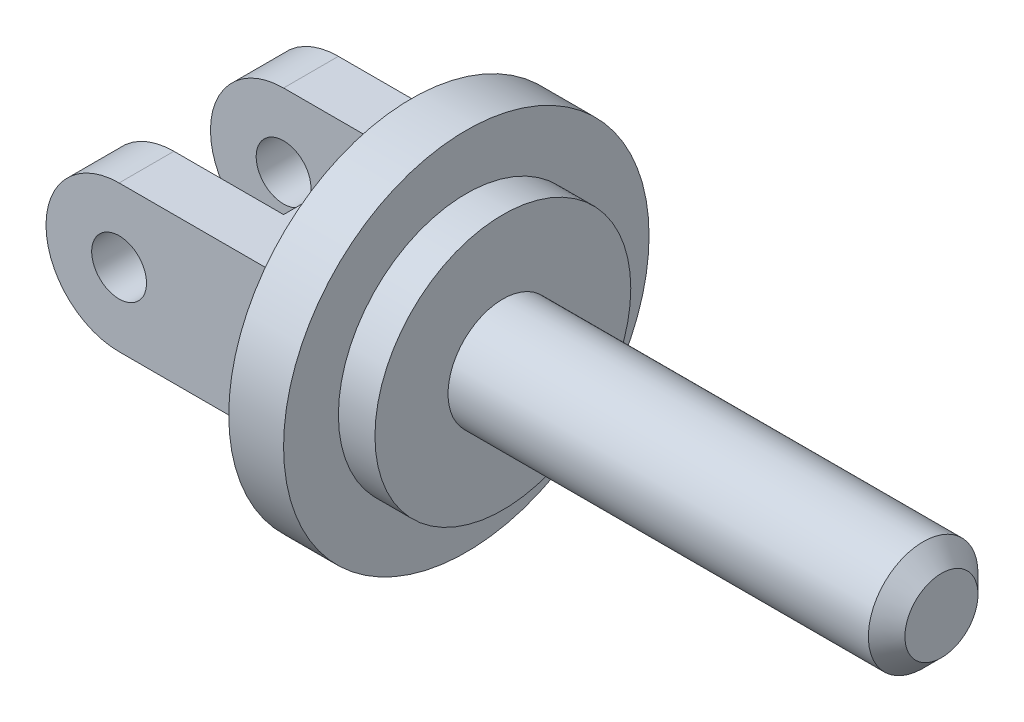
ISO-10303-21;
HEADER;
FILE_DESCRIPTION(('STEP AP214'),'2;1');
FILE_NAME('part.step','',(''),(''),'','','');
FILE_SCHEMA(('AUTOMOTIVE_DESIGN { 1 0 10303 214 1 1 1 1 }'));
ENDSEC;
DATA;
#1=APPLICATION_CONTEXT('core data for automotive mechanical design processes');
#2=APPLICATION_PROTOCOL_DEFINITION('international standard','automotive_design',2000,#1);
#3=PRODUCT_CONTEXT('',#1,'mechanical');
#4=PRODUCT('Part','Part','',(#3));
#5=PRODUCT_RELATED_PRODUCT_CATEGORY('part','',(#4));
#6=PRODUCT_DEFINITION_FORMATION('','',#4);
#7=PRODUCT_DEFINITION_CONTEXT('part definition',#1,'design');
#8=PRODUCT_DEFINITION('design','',#6,#7);
#9=PRODUCT_DEFINITION_SHAPE('','',#8);
#10=(LENGTH_UNIT() NAMED_UNIT(*) SI_UNIT(.MILLI.,.METRE.));
#11=(NAMED_UNIT(*) PLANE_ANGLE_UNIT() SI_UNIT($,.RADIAN.));
#12=(NAMED_UNIT(*) SI_UNIT($,.STERADIAN.) SOLID_ANGLE_UNIT());
#13=UNCERTAINTY_MEASURE_WITH_UNIT(LENGTH_MEASURE(1.E-05),#10,'distance_accuracy_value','');
#14=(GEOMETRIC_REPRESENTATION_CONTEXT(3) GLOBAL_UNCERTAINTY_ASSIGNED_CONTEXT((#13)) GLOBAL_UNIT_ASSIGNED_CONTEXT((#10,
#11,#12)) REPRESENTATION_CONTEXT('',''));
#15=CARTESIAN_POINT('',(0.,0.,0.));
#16=DIRECTION('',(0.,0.,1.));
#17=DIRECTION('',(1.,0.,0.));
#18=AXIS2_PLACEMENT_3D('',#15,#16,#17);
#19=CARTESIAN_POINT('',(0.,0.,3.));
#20=DIRECTION('',(0.,0.,-1.));
#21=DIRECTION('',(-1.,0.,0.));
#22=AXIS2_PLACEMENT_3D('',#19,#20,#21);
#23=CYLINDRICAL_SURFACE('',#22,2.);
#24=DIRECTION('',(0.,0.,-1.));
#25=VECTOR('',#24,1.);
#26=CARTESIAN_POINT('',(0.,2.,3.));
#27=LINE('',#26,#25);
#28=CARTESIAN_POINT('',(0.,2.,3.));
#29=VERTEX_POINT('',#28);
#30=CARTESIAN_POINT('',(0.,2.,1.5));
#31=VERTEX_POINT('',#30);
#32=EDGE_CURVE('E90',#29,#31,#27,.T.);
#33=ORIENTED_EDGE('',*,*,#32,.T.);
#34=CARTESIAN_POINT('',(0.,0.,1.5));
#35=DIRECTION('',(0.,0.,1.));
#36=DIRECTION('',(1.,0.,0.));
#37=AXIS2_PLACEMENT_3D('',#34,#35,#36);
#38=CIRCLE('',#37,2.);
#39=CARTESIAN_POINT('',(0.,-2.,1.5));
#40=VERTEX_POINT('',#39);
#41=EDGE_CURVE('E146',#31,#40,#38,.T.);
#42=ORIENTED_EDGE('',*,*,#41,.T.);
#43=DIRECTION('',(0.,0.,-1.));
#44=VECTOR('',#43,1.);
#45=CARTESIAN_POINT('',(0.,-2.,3.));
#46=LINE('',#45,#44);
#47=CARTESIAN_POINT('',(0.,-2.,3.));
#48=VERTEX_POINT('',#47);
#49=EDGE_CURVE('E195',#48,#40,#46,.T.);
#50=ORIENTED_EDGE('',*,*,#49,.F.);
#51=CARTESIAN_POINT('',(0.,0.,3.));
#52=DIRECTION('',(0.,0.,1.));
#53=DIRECTION('',(1.,0.,0.));
#54=AXIS2_PLACEMENT_3D('',#51,#52,#53);
#55=CIRCLE('',#54,2.);
#56=EDGE_CURVE('E171',#29,#48,#55,.T.);
#57=ORIENTED_EDGE('',*,*,#56,.F.);
#58=EDGE_LOOP('',(#33,#42,#50,#57));
#59=FACE_BOUND('',#58,.T.);
#60=ADVANCED_FACE('F43',(#59),#23,.T.);
#61=CARTESIAN_POINT('',(0.,0.,3.));
#62=DIRECTION('',(0.,0.,-1.));
#63=DIRECTION('',(-1.,0.,0.));
#64=AXIS2_PLACEMENT_3D('',#61,#62,#63);
#65=CYLINDRICAL_SURFACE('',#64,0.75);
#66=CARTESIAN_POINT('',(0.,0.,1.5));
#67=DIRECTION('',(0.,0.,1.));
#68=DIRECTION('',(1.,0.,0.));
#69=AXIS2_PLACEMENT_3D('',#66,#67,#68);
#70=CIRCLE('',#69,0.75);
#71=CARTESIAN_POINT('',(0.75,0.,1.5));
#72=VERTEX_POINT('',#71);
#73=EDGE_CURVE('E142',#72,#72,#70,.T.);
#74=ORIENTED_EDGE('',*,*,#73,.F.);
#75=EDGE_LOOP('',(#74));
#76=FACE_BOUND('',#75,.T.);
#77=CARTESIAN_POINT('',(0.,0.,3.));
#78=DIRECTION('',(0.,0.,1.));
#79=DIRECTION('',(1.,0.,0.));
#80=AXIS2_PLACEMENT_3D('',#77,#78,#79);
#81=CIRCLE('',#80,0.75);
#82=CARTESIAN_POINT('',(0.75,0.,3.));
#83=VERTEX_POINT('',#82);
#84=EDGE_CURVE('E166',#83,#83,#81,.T.);
#85=ORIENTED_EDGE('',*,*,#84,.T.);
#86=EDGE_LOOP('',(#85));
#87=FACE_BOUND('',#86,.T.);
#88=ADVANCED_FACE('F218',(#76,#87),#65,.F.);
#89=CARTESIAN_POINT('',(0.,2.,3.));
#90=DIRECTION('',(0.,1.,0.));
#91=DIRECTION('',(-1.,0.,0.));
#92=AXIS2_PLACEMENT_3D('',#89,#90,#91);
#93=PLANE('',#92);
#94=DIRECTION('',(1.,0.,0.));
#95=VECTOR('',#94,1.);
#96=CARTESIAN_POINT('',(-7.,2.,1.5));
#97=LINE('',#96,#95);
#98=CARTESIAN_POINT('',(3.,2.,1.5));
#99=VERTEX_POINT('',#98);
#100=EDGE_CURVE('E124',#31,#99,#97,.T.);
#101=ORIENTED_EDGE('',*,*,#100,.F.);
#102=ORIENTED_EDGE('',*,*,#32,.F.);
#103=DIRECTION('',(1.,0.,0.));
#104=VECTOR('',#103,1.);
#105=CARTESIAN_POINT('',(0.,2.,3.));
#106=LINE('',#105,#104);
#107=CARTESIAN_POINT('',(5.,2.,3.));
#108=VERTEX_POINT('',#107);
#109=EDGE_CURVE('E68',#29,#108,#106,.T.);
#110=ORIENTED_EDGE('',*,*,#109,.T.);
#111=DIRECTION('',(0.,0.,-1.));
#112=VECTOR('',#111,1.);
#113=CARTESIAN_POINT('',(5.,2.,3.));
#114=LINE('',#113,#112);
#115=CARTESIAN_POINT('',(5.,2.,-3.));
#116=VERTEX_POINT('',#115);
#117=EDGE_CURVE('E85',#108,#116,#114,.T.);
#118=ORIENTED_EDGE('',*,*,#117,.T.);
#119=DIRECTION('',(1.,0.,0.));
#120=VECTOR('',#119,1.);
#121=CARTESIAN_POINT('',(0.,2.,-3.));
#122=LINE('',#121,#120);
#123=CARTESIAN_POINT('',(0.,2.,-3.));
#124=VERTEX_POINT('',#123);
#125=EDGE_CURVE('E181',#124,#116,#122,.T.);
#126=ORIENTED_EDGE('',*,*,#125,.F.);
#127=CARTESIAN_POINT('',(0.,2.,-1.5));
#128=VERTEX_POINT('',#127);
#129=EDGE_CURVE('E134',#128,#124,#27,.T.);
#130=ORIENTED_EDGE('',*,*,#129,.F.);
#131=DIRECTION('',(-1.,0.,0.));
#132=VECTOR('',#131,1.);
#133=CARTESIAN_POINT('',(-7.,2.,-1.5));
#134=LINE('',#133,#132);
#135=CARTESIAN_POINT('',(3.,2.,-1.5));
#136=VERTEX_POINT('',#135);
#137=EDGE_CURVE('E119',#136,#128,#134,.T.);
#138=ORIENTED_EDGE('',*,*,#137,.F.);
#139=DIRECTION('',(0.,0.,-1.));
#140=VECTOR('',#139,1.);
#141=CARTESIAN_POINT('',(3.,2.,1.5));
#142=LINE('',#141,#140);
#143=EDGE_CURVE('E127',#99,#136,#142,.T.);
#144=ORIENTED_EDGE('',*,*,#143,.F.);
#145=EDGE_LOOP('',(#101,#102,#110,#118,#126,#130,#138,#144));
#146=FACE_BOUND('',#145,.T.);
#147=ADVANCED_FACE('F133',(#146),#93,.T.);
#148=CARTESIAN_POINT('',(0.,-2.,-1.5));
#149=VERTEX_POINT('',#148);
#150=CARTESIAN_POINT('',(0.,-2.,-3.));
#151=VERTEX_POINT('',#150);
#152=EDGE_CURVE('E194',#149,#151,#46,.T.);
#153=ORIENTED_EDGE('',*,*,#152,.F.);
#154=CARTESIAN_POINT('',(0.,0.,-1.5));
#155=DIRECTION('',(0.,0.,-1.));
#156=DIRECTION('',(-1.,0.,0.));
#157=AXIS2_PLACEMENT_3D('',#154,#155,#156);
#158=CIRCLE('',#157,2.);
#159=EDGE_CURVE('E59',#149,#128,#158,.T.);
#160=ORIENTED_EDGE('',*,*,#159,.T.);
#161=ORIENTED_EDGE('',*,*,#129,.T.);
#162=CARTESIAN_POINT('',(0.,0.,-3.));
#163=DIRECTION('',(0.,0.,1.));
#164=DIRECTION('',(1.,0.,0.));
#165=AXIS2_PLACEMENT_3D('',#162,#163,#164);
#166=CIRCLE('',#165,2.);
#167=EDGE_CURVE('E183',#124,#151,#166,.T.);
#168=ORIENTED_EDGE('',*,*,#167,.T.);
#169=EDGE_LOOP('',(#153,#160,#161,#168));
#170=FACE_BOUND('',#169,.T.);
#171=ADVANCED_FACE('F221',(#170),#23,.T.);
#172=CARTESIAN_POINT('',(0.,-2.,3.));
#173=DIRECTION('',(0.,1.,0.));
#174=DIRECTION('',(-1.,0.,0.));
#175=AXIS2_PLACEMENT_3D('',#172,#173,#174);
#176=PLANE('',#175);
#177=ORIENTED_EDGE('',*,*,#49,.T.);
#178=DIRECTION('',(1.,0.,0.));
#179=VECTOR('',#178,1.);
#180=CARTESIAN_POINT('',(0.,-2.,1.5));
#181=LINE('',#180,#179);
#182=CARTESIAN_POINT('',(3.,-2.,1.5));
#183=VERTEX_POINT('',#182);
#184=EDGE_CURVE('E143',#40,#183,#181,.T.);
#185=ORIENTED_EDGE('',*,*,#184,.T.);
#186=DIRECTION('',(0.,0.,-1.));
#187=VECTOR('',#186,1.);
#188=CARTESIAN_POINT('',(3.,-2.,3.));
#189=LINE('',#188,#187);
#190=CARTESIAN_POINT('',(3.,-2.,-1.5));
#191=VERTEX_POINT('',#190);
#192=EDGE_CURVE('E153',#183,#191,#189,.T.);
#193=ORIENTED_EDGE('',*,*,#192,.T.);
#194=DIRECTION('',(-1.,0.,0.));
#195=VECTOR('',#194,1.);
#196=CARTESIAN_POINT('',(0.,-2.,-1.5));
#197=LINE('',#196,#195);
#198=EDGE_CURVE('E120',#191,#149,#197,.T.);
#199=ORIENTED_EDGE('',*,*,#198,.T.);
#200=ORIENTED_EDGE('',*,*,#152,.T.);
#201=DIRECTION('',(1.,0.,0.));
#202=VECTOR('',#201,1.);
#203=CARTESIAN_POINT('',(0.,-2.,-3.));
#204=LINE('',#203,#202);
#205=CARTESIAN_POINT('',(5.,-2.,-3.));
#206=VERTEX_POINT('',#205);
#207=EDGE_CURVE('E186',#151,#206,#204,.T.);
#208=ORIENTED_EDGE('',*,*,#207,.T.);
#209=DIRECTION('',(0.,0.,-1.));
#210=VECTOR('',#209,1.);
#211=CARTESIAN_POINT('',(5.,-2.,3.));
#212=LINE('',#211,#210);
#213=CARTESIAN_POINT('',(5.,-2.,3.));
#214=VERTEX_POINT('',#213);
#215=EDGE_CURVE('E191',#214,#206,#212,.T.);
#216=ORIENTED_EDGE('',*,*,#215,.F.);
#217=DIRECTION('',(1.,0.,0.));
#218=VECTOR('',#217,1.);
#219=CARTESIAN_POINT('',(0.,-2.,3.));
#220=LINE('',#219,#218);
#221=EDGE_CURVE('E174',#48,#214,#220,.T.);
#222=ORIENTED_EDGE('',*,*,#221,.F.);
#223=EDGE_LOOP('',(#177,#185,#193,#199,#200,#208,#216,#222));
#224=FACE_BOUND('',#223,.T.);
#225=ADVANCED_FACE('F230',(#224),#176,.F.);
#226=CARTESIAN_POINT('',(0.,0.,-1.5));
#227=DIRECTION('',(0.,0.,-1.));
#228=DIRECTION('',(-1.,0.,0.));
#229=AXIS2_PLACEMENT_3D('',#226,#227,#228);
#230=CIRCLE('',#229,0.75);
#231=CARTESIAN_POINT('',(-0.75,0.,-1.5));
#232=VERTEX_POINT('',#231);
#233=EDGE_CURVE('E138',#232,#232,#230,.T.);
#234=ORIENTED_EDGE('',*,*,#233,.F.);
#235=EDGE_LOOP('',(#234));
#236=FACE_BOUND('',#235,.T.);
#237=CARTESIAN_POINT('',(0.,0.,-3.));
#238=DIRECTION('',(0.,0.,1.));
#239=DIRECTION('',(1.,0.,0.));
#240=AXIS2_PLACEMENT_3D('',#237,#238,#239);
#241=CIRCLE('',#240,0.75);
#242=CARTESIAN_POINT('',(0.75,0.,-3.));
#243=VERTEX_POINT('',#242);
#244=EDGE_CURVE('E163',#243,#243,#241,.T.);
#245=ORIENTED_EDGE('',*,*,#244,.F.);
#246=EDGE_LOOP('',(#245));
#247=FACE_BOUND('',#246,.T.);
#248=ADVANCED_FACE('F226',(#236,#247),#65,.F.);
#249=CARTESIAN_POINT('',(0.,0.,3.));
#250=DIRECTION('',(0.,0.,1.));
#251=DIRECTION('',(1.,0.,0.));
#252=AXIS2_PLACEMENT_3D('',#249,#250,#251);
#253=PLANE('',#252);
#254=ORIENTED_EDGE('',*,*,#84,.F.);
#255=EDGE_LOOP('',(#254));
#256=FACE_BOUND('',#255,.T.);
#257=ORIENTED_EDGE('',*,*,#109,.F.);
#258=ORIENTED_EDGE('',*,*,#56,.T.);
#259=ORIENTED_EDGE('',*,*,#221,.T.);
#260=DIRECTION('',(0.,-1.,0.));
#261=VECTOR('',#260,1.);
#262=CARTESIAN_POINT('',(5.,0.,3.));
#263=LINE('',#262,#261);
#264=EDGE_CURVE('E176',#108,#214,#263,.T.);
#265=ORIENTED_EDGE('',*,*,#264,.F.);
#266=EDGE_LOOP('',(#257,#258,#259,#265));
#267=FACE_BOUND('',#266,.T.);
#268=ADVANCED_FACE('F249',(#256,#267),#253,.T.);
#269=CARTESIAN_POINT('',(0.,0.,-3.));
#270=DIRECTION('',(0.,0.,1.));
#271=DIRECTION('',(1.,0.,0.));
#272=AXIS2_PLACEMENT_3D('',#269,#270,#271);
#273=PLANE('',#272);
#274=ORIENTED_EDGE('',*,*,#244,.T.);
#275=EDGE_LOOP('',(#274));
#276=FACE_BOUND('',#275,.T.);
#277=ORIENTED_EDGE('',*,*,#125,.T.);
#278=DIRECTION('',(0.,-1.,0.));
#279=VECTOR('',#278,1.);
#280=CARTESIAN_POINT('',(5.,0.,-3.));
#281=LINE('',#280,#279);
#282=EDGE_CURVE('E169',#116,#206,#281,.T.);
#283=ORIENTED_EDGE('',*,*,#282,.T.);
#284=ORIENTED_EDGE('',*,*,#207,.F.);
#285=ORIENTED_EDGE('',*,*,#167,.F.);
#286=EDGE_LOOP('',(#277,#283,#284,#285));
#287=FACE_BOUND('',#286,.T.);
#288=ADVANCED_FACE('F242',(#276,#287),#273,.F.);
#289=CARTESIAN_POINT('',(6.5,0.,0.));
#290=DIRECTION('',(-1.,0.,0.));
#291=DIRECTION('',(0.,0.,1.));
#292=AXIS2_PLACEMENT_3D('',#289,#290,#291);
#293=CYLINDRICAL_SURFACE('',#292,5.);
#294=CARTESIAN_POINT('',(6.5,0.,0.));
#295=DIRECTION('',(1.,0.,0.));
#296=DIRECTION('',(0.,0.,-1.));
#297=AXIS2_PLACEMENT_3D('',#294,#295,#296);
#298=CIRCLE('',#297,5.);
#299=CARTESIAN_POINT('',(6.5,0.,-5.));
#300=VERTEX_POINT('',#299);
#301=EDGE_CURVE('E160',#300,#300,#298,.T.);
#302=ORIENTED_EDGE('',*,*,#301,.F.);
#303=EDGE_LOOP('',(#302));
#304=FACE_BOUND('',#303,.T.);
#305=CARTESIAN_POINT('',(5.,0.,0.));
#306=DIRECTION('',(1.,0.,0.));
#307=DIRECTION('',(0.,0.,-1.));
#308=AXIS2_PLACEMENT_3D('',#305,#306,#307);
#309=CIRCLE('',#308,5.);
#310=CARTESIAN_POINT('',(5.,0.,-5.));
#311=VERTEX_POINT('',#310);
#312=EDGE_CURVE('E157',#311,#311,#309,.T.);
#313=ORIENTED_EDGE('',*,*,#312,.T.);
#314=EDGE_LOOP('',(#313));
#315=FACE_BOUND('',#314,.T.);
#316=ADVANCED_FACE('F276',(#304,#315),#293,.T.);
#317=CARTESIAN_POINT('',(6.5,0.,0.));
#318=DIRECTION('',(1.,0.,0.));
#319=DIRECTION('',(0.,0.,-1.));
#320=AXIS2_PLACEMENT_3D('',#317,#318,#319);
#321=PLANE('',#320);
#322=CARTESIAN_POINT('',(6.5,0.,0.));
#323=DIRECTION('',(1.,0.,0.));
#324=DIRECTION('',(0.,0.,-1.));
#325=AXIS2_PLACEMENT_3D('',#322,#323,#324);
#326=CIRCLE('',#325,3.5);
#327=CARTESIAN_POINT('',(6.5,0.,-3.5));
#328=VERTEX_POINT('',#327);
#329=EDGE_CURVE('E154',#328,#328,#326,.T.);
#330=ORIENTED_EDGE('',*,*,#329,.F.);
#331=EDGE_LOOP('',(#330));
#332=FACE_BOUND('',#331,.T.);
#333=ORIENTED_EDGE('',*,*,#301,.T.);
#334=EDGE_LOOP('',(#333));
#335=FACE_BOUND('',#334,.T.);
#336=ADVANCED_FACE('F273',(#332,#335),#321,.T.);
#337=CARTESIAN_POINT('',(5.,0.,0.));
#338=DIRECTION('',(1.,0.,0.));
#339=DIRECTION('',(0.,0.,-1.));
#340=AXIS2_PLACEMENT_3D('',#337,#338,#339);
#341=PLANE('',#340);
#342=ORIENTED_EDGE('',*,*,#282,.F.);
#343=ORIENTED_EDGE('',*,*,#117,.F.);
#344=ORIENTED_EDGE('',*,*,#264,.T.);
#345=ORIENTED_EDGE('',*,*,#215,.T.);
#346=EDGE_LOOP('',(#342,#343,#344,#345));
#347=FACE_BOUND('',#346,.T.);
#348=ORIENTED_EDGE('',*,*,#312,.F.);
#349=EDGE_LOOP('',(#348));
#350=FACE_BOUND('',#349,.T.);
#351=ADVANCED_FACE('F245',(#347,#350),#341,.F.);
#352=CARTESIAN_POINT('',(7.5,0.,0.));
#353=DIRECTION('',(-1.,0.,0.));
#354=DIRECTION('',(0.,0.,1.));
#355=AXIS2_PLACEMENT_3D('',#352,#353,#354);
#356=CYLINDRICAL_SURFACE('',#355,3.5);
#357=CARTESIAN_POINT('',(7.5,0.,0.));
#358=DIRECTION('',(1.,0.,0.));
#359=DIRECTION('',(0.,0.,-1.));
#360=AXIS2_PLACEMENT_3D('',#357,#358,#359);
#361=CIRCLE('',#360,3.5);
#362=CARTESIAN_POINT('',(7.5,0.,-3.5));
#363=VERTEX_POINT('',#362);
#364=EDGE_CURVE('E149',#363,#363,#361,.T.);
#365=ORIENTED_EDGE('',*,*,#364,.F.);
#366=EDGE_LOOP('',(#365));
#367=FACE_BOUND('',#366,.T.);
#368=ORIENTED_EDGE('',*,*,#329,.T.);
#369=EDGE_LOOP('',(#368));
#370=FACE_BOUND('',#369,.T.);
#371=ADVANCED_FACE('F268',(#367,#370),#356,.T.);
#372=CARTESIAN_POINT('',(7.5,0.,0.));
#373=DIRECTION('',(1.,0.,0.));
#374=DIRECTION('',(0.,0.,-1.));
#375=AXIS2_PLACEMENT_3D('',#372,#373,#374);
#376=PLANE('',#375);
#377=CARTESIAN_POINT('',(7.5,0.,0.));
#378=DIRECTION('',(1.,0.,0.));
#379=DIRECTION('',(0.,0.,-1.));
#380=AXIS2_PLACEMENT_3D('',#377,#378,#379);
#381=CIRCLE('',#380,1.5);
#382=CARTESIAN_POINT('',(7.5,0.,-1.5));
#383=VERTEX_POINT('',#382);
#384=EDGE_CURVE('E150',#383,#383,#381,.T.);
#385=ORIENTED_EDGE('',*,*,#384,.F.);
#386=EDGE_LOOP('',(#385));
#387=FACE_BOUND('',#386,.T.);
#388=ORIENTED_EDGE('',*,*,#364,.T.);
#389=EDGE_LOOP('',(#388));
#390=FACE_BOUND('',#389,.T.);
#391=ADVANCED_FACE('F264',(#387,#390),#376,.T.);
#392=CARTESIAN_POINT('',(19.5,0.,0.));
#393=DIRECTION('',(-1.,0.,0.));
#394=DIRECTION('',(0.,0.,1.));
#395=AXIS2_PLACEMENT_3D('',#392,#393,#394);
#396=CYLINDRICAL_SURFACE('',#395,1.5);
#397=CARTESIAN_POINT('',(19.,0.,0.));
#398=DIRECTION('',(1.,0.,0.));
#399=DIRECTION('',(0.,0.,-1.));
#400=AXIS2_PLACEMENT_3D('',#397,#398,#399);
#401=CIRCLE('',#400,1.5);
#402=CARTESIAN_POINT('',(19.,0.,-1.5));
#403=VERTEX_POINT('',#402);
#404=EDGE_CURVE('E11',#403,#403,#401,.F.);
#405=ORIENTED_EDGE('',*,*,#404,.T.);
#406=EDGE_LOOP('',(#405));
#407=FACE_BOUND('',#406,.T.);
#408=ORIENTED_EDGE('',*,*,#384,.T.);
#409=EDGE_LOOP('',(#408));
#410=FACE_BOUND('',#409,.T.);
#411=ADVANCED_FACE('F261',(#407,#410),#396,.T.);
#412=CARTESIAN_POINT('',(19.5,0.,0.));
#413=DIRECTION('',(1.,0.,0.));
#414=DIRECTION('',(0.,0.,-1.));
#415=AXIS2_PLACEMENT_3D('',#412,#413,#414);
#416=PLANE('',#415);
#417=CARTESIAN_POINT('',(19.5,0.,0.));
#418=DIRECTION('',(1.,0.,0.));
#419=DIRECTION('',(0.,0.,-1.));
#420=AXIS2_PLACEMENT_3D('',#417,#418,#419);
#421=CIRCLE('',#420,0.999999999999997);
#422=CARTESIAN_POINT('',(19.5,0.,-0.999999999999997));
#423=VERTEX_POINT('',#422);
#424=EDGE_CURVE('E52',#423,#423,#421,.T.);
#425=ORIENTED_EDGE('',*,*,#424,.T.);
#426=EDGE_LOOP('',(#425));
#427=FACE_BOUND('',#426,.T.);
#428=ADVANCED_FACE('F206',(#427),#416,.T.);
#429=CARTESIAN_POINT('',(3.,-5.00000000000001,1.5));
#430=DIRECTION('',(1.,0.,0.));
#431=DIRECTION('',(0.,1.,0.));
#432=AXIS2_PLACEMENT_3D('',#429,#430,#431);
#433=PLANE('',#432);
#434=DIRECTION('',(0.,1.,0.));
#435=VECTOR('',#434,1.);
#436=CARTESIAN_POINT('',(3.,-5.00000000000001,1.5));
#437=LINE('',#436,#435);
#438=EDGE_CURVE('E123',#183,#99,#437,.T.);
#439=ORIENTED_EDGE('',*,*,#438,.T.);
#440=ORIENTED_EDGE('',*,*,#143,.T.);
#441=DIRECTION('',(0.,1.,0.));
#442=VECTOR('',#441,1.);
#443=CARTESIAN_POINT('',(3.,-5.00000000000001,-1.5));
#444=LINE('',#443,#442);
#445=EDGE_CURVE('E115',#191,#136,#444,.T.);
#446=ORIENTED_EDGE('',*,*,#445,.F.);
#447=ORIENTED_EDGE('',*,*,#192,.F.);
#448=EDGE_LOOP('',(#439,#440,#446,#447));
#449=FACE_BOUND('',#448,.T.);
#450=ADVANCED_FACE('F128',(#449),#433,.F.);
#451=CARTESIAN_POINT('',(-7.,-5.00000000000001,1.5));
#452=DIRECTION('',(0.,0.,1.));
#453=DIRECTION('',(1.,0.,0.));
#454=AXIS2_PLACEMENT_3D('',#451,#452,#453);
#455=PLANE('',#454);
#456=ORIENTED_EDGE('',*,*,#73,.T.);
#457=EDGE_LOOP('',(#456));
#458=FACE_BOUND('',#457,.T.);
#459=ORIENTED_EDGE('',*,*,#100,.T.);
#460=ORIENTED_EDGE('',*,*,#438,.F.);
#461=ORIENTED_EDGE('',*,*,#184,.F.);
#462=ORIENTED_EDGE('',*,*,#41,.F.);
#463=EDGE_LOOP('',(#459,#460,#461,#462));
#464=FACE_BOUND('',#463,.T.);
#465=ADVANCED_FACE('F213',(#458,#464),#455,.F.);
#466=CARTESIAN_POINT('',(-7.,-5.00000000000001,-1.5));
#467=DIRECTION('',(0.,0.,-1.));
#468=DIRECTION('',(-1.,0.,0.));
#469=AXIS2_PLACEMENT_3D('',#466,#467,#468);
#470=PLANE('',#469);
#471=ORIENTED_EDGE('',*,*,#233,.T.);
#472=EDGE_LOOP('',(#471));
#473=FACE_BOUND('',#472,.T.);
#474=ORIENTED_EDGE('',*,*,#198,.F.);
#475=ORIENTED_EDGE('',*,*,#445,.T.);
#476=ORIENTED_EDGE('',*,*,#137,.T.);
#477=ORIENTED_EDGE('',*,*,#159,.F.);
#478=EDGE_LOOP('',(#474,#475,#476,#477));
#479=FACE_BOUND('',#478,.T.);
#480=ADVANCED_FACE('F117',(#473,#479),#470,.F.);
#481=CARTESIAN_POINT('',(19.5,0.,0.));
#482=DIRECTION('',(-1.,0.,0.));
#483=DIRECTION('',(0.,0.,1.));
#484=AXIS2_PLACEMENT_3D('',#481,#482,#483);
#485=CONICAL_SURFACE('',#484,0.999999999999997,0.785398163397451);
#486=ORIENTED_EDGE('',*,*,#404,.F.);
#487=EDGE_LOOP('',(#486));
#488=FACE_BOUND('',#487,.T.);
#489=ORIENTED_EDGE('',*,*,#424,.F.);
#490=EDGE_LOOP('',(#489));
#491=FACE_BOUND('',#490,.T.);
#492=ADVANCED_FACE('F46',(#488,#491),#485,.T.);
#493=CLOSED_SHELL('',(#60,#88,#147,#171,#225,#248,#268,#288,#316,#336,#351,#371,#391,#411,#428,
#450,#465,#480,#492));
#494=MANIFOLD_SOLID_BREP('B2',#493);
#495=ADVANCED_BREP_SHAPE_REPRESENTATION('',(#18,#494),#14);
#496=SHAPE_DEFINITION_REPRESENTATION(#9,#495);
ENDSEC;
END-ISO-10303-21;
